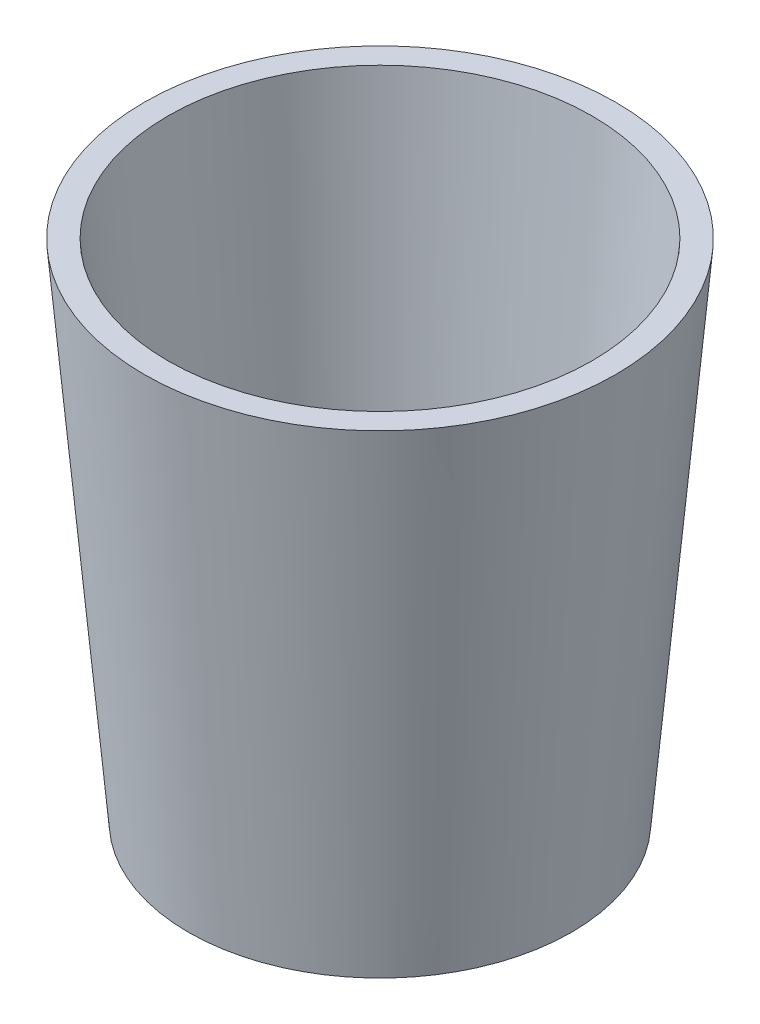
ISO-10303-21;
HEADER;
FILE_DESCRIPTION(('STEP AP214'),'2;1');
FILE_NAME('part.step','',(''),(''),'','','');
FILE_SCHEMA(('AUTOMOTIVE_DESIGN { 1 0 10303 214 1 1 1 1 }'));
ENDSEC;
DATA;
#1=APPLICATION_CONTEXT('core data for automotive mechanical design processes');
#2=APPLICATION_PROTOCOL_DEFINITION('international standard','automotive_design',2000,#1);
#3=PRODUCT_CONTEXT('',#1,'mechanical');
#4=PRODUCT('Part','Part','',(#3));
#5=PRODUCT_RELATED_PRODUCT_CATEGORY('part','',(#4));
#6=PRODUCT_DEFINITION_FORMATION('','',#4);
#7=PRODUCT_DEFINITION_CONTEXT('part definition',#1,'design');
#8=PRODUCT_DEFINITION('design','',#6,#7);
#9=PRODUCT_DEFINITION_SHAPE('','',#8);
#10=(LENGTH_UNIT() NAMED_UNIT(*) SI_UNIT(.MILLI.,.METRE.));
#11=(NAMED_UNIT(*) PLANE_ANGLE_UNIT() SI_UNIT($,.RADIAN.));
#12=(NAMED_UNIT(*) SI_UNIT($,.STERADIAN.) SOLID_ANGLE_UNIT());
#13=UNCERTAINTY_MEASURE_WITH_UNIT(LENGTH_MEASURE(1.E-05),#10,'distance_accuracy_value','');
#14=(GEOMETRIC_REPRESENTATION_CONTEXT(3) GLOBAL_UNCERTAINTY_ASSIGNED_CONTEXT((#13)) GLOBAL_UNIT_ASSIGNED_CONTEXT((#10,
#11,#12)) REPRESENTATION_CONTEXT('',''));
#15=CARTESIAN_POINT('',(0.,0.,0.));
#16=DIRECTION('',(0.,0.,1.));
#17=DIRECTION('',(1.,0.,0.));
#18=AXIS2_PLACEMENT_3D('',#15,#16,#17);
#19=CARTESIAN_POINT('',(56.8767004711119,150.,0.));
#20=DIRECTION('',(0.,1.,0.));
#21=DIRECTION('',(0.,0.,1.));
#22=AXIS2_PLACEMENT_3D('',#19,#20,#21);
#23=CONICAL_SURFACE('',#22,70.,0.0872664625997133);
#24=CARTESIAN_POINT('',(56.8767004711119,0.,0.));
#25=DIRECTION('',(0.,-1.,0.));
#26=DIRECTION('',(0.,0.,-1.));
#27=AXIS2_PLACEMENT_3D('',#24,#25,#26);
#28=CIRCLE('',#27,56.8767004711119);
#29=CARTESIAN_POINT('',(56.8767004711119,0.,-56.8767004711119));
#30=VERTEX_POINT('',#29);
#31=EDGE_CURVE('E10',#30,#30,#28,.T.);
#32=ORIENTED_EDGE('',*,*,#31,.F.);
#33=EDGE_LOOP('',(#32));
#34=FACE_BOUND('',#33,.T.);
#35=CARTESIAN_POINT('',(56.8767004711119,150.,0.));
#36=DIRECTION('',(0.,-1.,0.));
#37=DIRECTION('',(0.,0.,-1.));
#38=AXIS2_PLACEMENT_3D('',#35,#36,#37);
#39=CIRCLE('',#38,70.);
#40=CARTESIAN_POINT('',(56.8767004711119,150.,-70.));
#41=VERTEX_POINT('',#40);
#42=EDGE_CURVE('E60',#41,#41,#39,.T.);
#43=ORIENTED_EDGE('',*,*,#42,.T.);
#44=EDGE_LOOP('',(#43));
#45=FACE_BOUND('',#44,.T.);
#46=ADVANCED_FACE('F43',(#34,#45),#23,.T.);
#47=CARTESIAN_POINT('',(0.,0.,0.));
#48=DIRECTION('',(0.,1.,0.));
#49=DIRECTION('',(0.,0.,1.));
#50=AXIS2_PLACEMENT_3D('',#47,#48,#49);
#51=PLANE('',#50);
#52=ORIENTED_EDGE('',*,*,#31,.T.);
#53=EDGE_LOOP('',(#52));
#54=FACE_BOUND('',#53,.T.);
#55=ADVANCED_FACE('F81',(#54),#51,.F.);
#56=CARTESIAN_POINT('',(56.8767004711119,20.,0.));
#57=DIRECTION('',(0.,-1.,0.));
#58=DIRECTION('',(0.,0.,-1.));
#59=AXIS2_PLACEMENT_3D('',#56,#57,#58);
#60=PLANE('',#59);
#61=CARTESIAN_POINT('',(56.8767004711119,20.,0.));
#62=DIRECTION('',(0.,-1.,0.));
#63=DIRECTION('',(0.,0.,-1.));
#64=AXIS2_PLACEMENT_3D('',#61,#62,#63);
#65=CIRCLE('',#64,51.5997348788269);
#66=CARTESIAN_POINT('',(56.8767004711119,20.,-51.5997348788269));
#67=VERTEX_POINT('',#66);
#68=EDGE_CURVE('E50',#67,#67,#65,.T.);
#69=ORIENTED_EDGE('',*,*,#68,.F.);
#70=EDGE_LOOP('',(#69));
#71=FACE_BOUND('',#70,.T.);
#72=ADVANCED_FACE('F76',(#71),#60,.F.);
#73=CARTESIAN_POINT('',(56.8767004711119,20.,0.));
#74=DIRECTION('',(0.,1.,0.));
#75=DIRECTION('',(0.,0.,1.));
#76=AXIS2_PLACEMENT_3D('',#73,#74,#75);
#77=CONICAL_SURFACE('',#76,51.5997348788269,0.0872664625997134);
#78=CARTESIAN_POINT('',(56.8767004711119,150.,0.));
#79=DIRECTION('',(0.,-1.,0.));
#80=DIRECTION('',(0.,0.,-1.));
#81=AXIS2_PLACEMENT_3D('',#78,#79,#80);
#82=CIRCLE('',#81,62.9732611371966);
#83=CARTESIAN_POINT('',(56.8767004711119,150.,-62.9732611371966));
#84=VERTEX_POINT('',#83);
#85=EDGE_CURVE('E55',#84,#84,#82,.T.);
#86=ORIENTED_EDGE('',*,*,#85,.F.);
#87=EDGE_LOOP('',(#86));
#88=FACE_BOUND('',#87,.T.);
#89=ORIENTED_EDGE('',*,*,#68,.T.);
#90=EDGE_LOOP('',(#89));
#91=FACE_BOUND('',#90,.T.);
#92=ADVANCED_FACE('F71',(#88,#91),#77,.F.);
#93=CARTESIAN_POINT('',(-6.09656066608471,150.,0.));
#94=DIRECTION('',(0.,-1.,0.));
#95=DIRECTION('',(0.,0.,-1.));
#96=AXIS2_PLACEMENT_3D('',#93,#94,#95);
#97=PLANE('',#96);
#98=ORIENTED_EDGE('',*,*,#42,.F.);
#99=EDGE_LOOP('',(#98));
#100=FACE_BOUND('',#99,.T.);
#101=ORIENTED_EDGE('',*,*,#85,.T.);
#102=EDGE_LOOP('',(#101));
#103=FACE_BOUND('',#102,.T.);
#104=ADVANCED_FACE('F68',(#100,#103),#97,.F.);
#105=CLOSED_SHELL('',(#46,#55,#72,#92,#104));
#106=MANIFOLD_SOLID_BREP('B2',#105);
#107=ADVANCED_BREP_SHAPE_REPRESENTATION('',(#18,#106),#14);
#108=SHAPE_DEFINITION_REPRESENTATION(#9,#107);
ENDSEC;
END-ISO-10303-21;
